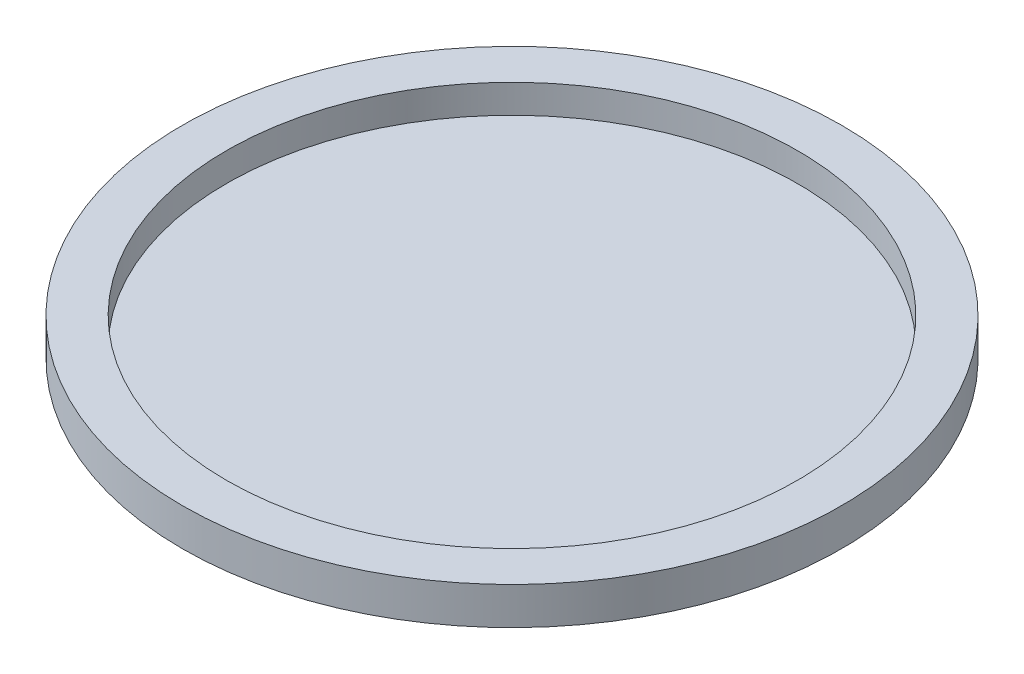
ISO-10303-21;
HEADER;
FILE_DESCRIPTION(('STEP AP214'),'2;1');
FILE_NAME('part.step','',(''),(''),'','','');
FILE_SCHEMA(('AUTOMOTIVE_DESIGN { 1 0 10303 214 1 1 1 1 }'));
ENDSEC;
DATA;
#1=APPLICATION_CONTEXT('core data for automotive mechanical design processes');
#2=APPLICATION_PROTOCOL_DEFINITION('international standard','automotive_design',2000,#1);
#3=PRODUCT_CONTEXT('',#1,'mechanical');
#4=PRODUCT('Part','Part','',(#3));
#5=PRODUCT_RELATED_PRODUCT_CATEGORY('part','',(#4));
#6=PRODUCT_DEFINITION_FORMATION('','',#4);
#7=PRODUCT_DEFINITION_CONTEXT('part definition',#1,'design');
#8=PRODUCT_DEFINITION('design','',#6,#7);
#9=PRODUCT_DEFINITION_SHAPE('','',#8);
#10=(LENGTH_UNIT() NAMED_UNIT(*) SI_UNIT(.MILLI.,.METRE.));
#11=(NAMED_UNIT(*) PLANE_ANGLE_UNIT() SI_UNIT($,.RADIAN.));
#12=(NAMED_UNIT(*) SI_UNIT($,.STERADIAN.) SOLID_ANGLE_UNIT());
#13=UNCERTAINTY_MEASURE_WITH_UNIT(LENGTH_MEASURE(1.E-05),#10,'distance_accuracy_value','');
#14=(GEOMETRIC_REPRESENTATION_CONTEXT(3) GLOBAL_UNCERTAINTY_ASSIGNED_CONTEXT((#13)) GLOBAL_UNIT_ASSIGNED_CONTEXT((#10,
#11,#12)) REPRESENTATION_CONTEXT('',''));
#15=CARTESIAN_POINT('',(0.,0.,0.));
#16=DIRECTION('',(0.,0.,1.));
#17=DIRECTION('',(1.,0.,0.));
#18=AXIS2_PLACEMENT_3D('',#15,#16,#17);
#19=CARTESIAN_POINT('',(0.,-0.2,0.));
#20=DIRECTION('',(0.,-1.,0.));
#21=DIRECTION('',(0.,0.,-1.));
#22=AXIS2_PLACEMENT_3D('',#19,#20,#21);
#23=TOROIDAL_SURFACE('',#22,12.4036061854202,1.);
#24=CARTESIAN_POINT('',(0.,-1.2,0.));
#25=DIRECTION('',(0.,-1.,0.));
#26=DIRECTION('',(0.,0.,-1.));
#27=AXIS2_PLACEMENT_3D('',#24,#25,#26);
#28=CIRCLE('',#27,12.4036061854202);
#29=CARTESIAN_POINT('',(0.,-1.2,-12.4036061854202));
#30=VERTEX_POINT('',#29);
#31=EDGE_CURVE('E38',#30,#30,#28,.T.);
#32=ORIENTED_EDGE('',*,*,#31,.F.);
#33=EDGE_LOOP('',(#32));
#34=FACE_BOUND('',#33,.T.);
#35=CARTESIAN_POINT('',(0.,-0.2,0.));
#36=DIRECTION('',(0.,-1.,0.));
#37=DIRECTION('',(0.,0.,-1.));
#38=AXIS2_PLACEMENT_3D('',#35,#36,#37);
#39=CIRCLE('',#38,13.4036061854202);
#40=CARTESIAN_POINT('',(0.,-0.2,-13.4036061854202));
#41=VERTEX_POINT('',#40);
#42=EDGE_CURVE('E10',#41,#41,#39,.F.);
#43=ORIENTED_EDGE('',*,*,#42,.F.);
#44=EDGE_LOOP('',(#43));
#45=FACE_BOUND('',#44,.T.);
#46=ADVANCED_FACE('F32',(#34,#45),#23,.T.);
#47=CARTESIAN_POINT('',(0.,1.7,0.));
#48=DIRECTION('',(0.,-1.,0.));
#49=DIRECTION('',(0.,0.,-1.));
#50=AXIS2_PLACEMENT_3D('',#47,#48,#49);
#51=CYLINDRICAL_SURFACE('',#50,15.);
#52=CARTESIAN_POINT('',(0.,1.7,0.));
#53=DIRECTION('',(0.,1.,0.));
#54=DIRECTION('',(0.,0.,1.));
#55=AXIS2_PLACEMENT_3D('',#52,#53,#54);
#56=CIRCLE('',#55,15.);
#57=CARTESIAN_POINT('',(0.,1.7,15.));
#58=VERTEX_POINT('',#57);
#59=EDGE_CURVE('E46',#58,#58,#56,.T.);
#60=ORIENTED_EDGE('',*,*,#59,.F.);
#61=EDGE_LOOP('',(#60));
#62=FACE_BOUND('',#61,.T.);
#63=CARTESIAN_POINT('',(0.,0.,0.));
#64=DIRECTION('',(0.,1.,0.));
#65=DIRECTION('',(0.,0.,1.));
#66=AXIS2_PLACEMENT_3D('',#63,#64,#65);
#67=CIRCLE('',#66,15.);
#68=CARTESIAN_POINT('',(0.,0.,15.));
#69=VERTEX_POINT('',#68);
#70=EDGE_CURVE('E49',#69,#69,#67,.T.);
#71=ORIENTED_EDGE('',*,*,#70,.T.);
#72=EDGE_LOOP('',(#71));
#73=FACE_BOUND('',#72,.T.);
#74=ADVANCED_FACE('F80',(#62,#73),#51,.T.);
#75=CARTESIAN_POINT('',(0.,1.7,0.));
#76=DIRECTION('',(0.,1.,0.));
#77=DIRECTION('',(0.,0.,1.));
#78=AXIS2_PLACEMENT_3D('',#75,#76,#77);
#79=PLANE('',#78);
#80=CARTESIAN_POINT('',(0.,1.7,0.));
#81=DIRECTION('',(0.,1.,0.));
#82=DIRECTION('',(0.,0.,1.));
#83=AXIS2_PLACEMENT_3D('',#80,#81,#82);
#84=CIRCLE('',#83,12.9986334966851);
#85=CARTESIAN_POINT('',(0.,1.7,12.9986334966851));
#86=VERTEX_POINT('',#85);
#87=EDGE_CURVE('E61',#86,#86,#84,.T.);
#88=ORIENTED_EDGE('',*,*,#87,.F.);
#89=EDGE_LOOP('',(#88));
#90=FACE_BOUND('',#89,.T.);
#91=ORIENTED_EDGE('',*,*,#59,.T.);
#92=EDGE_LOOP('',(#91));
#93=FACE_BOUND('',#92,.T.);
#94=ADVANCED_FACE('F76',(#90,#93),#79,.T.);
#95=CARTESIAN_POINT('',(0.,0.,0.));
#96=DIRECTION('',(0.,1.,0.));
#97=DIRECTION('',(0.,0.,1.));
#98=AXIS2_PLACEMENT_3D('',#95,#96,#97);
#99=PLANE('',#98);
#100=CARTESIAN_POINT('',(0.,0.,0.));
#101=DIRECTION('',(0.,1.,0.));
#102=DIRECTION('',(0.,0.,1.));
#103=AXIS2_PLACEMENT_3D('',#100,#101,#102);
#104=CIRCLE('',#103,13.4036061854202);
#105=CARTESIAN_POINT('',(0.,0.,13.4036061854202));
#106=VERTEX_POINT('',#105);
#107=EDGE_CURVE('E42',#106,#106,#104,.F.);
#108=ORIENTED_EDGE('',*,*,#107,.F.);
#109=EDGE_LOOP('',(#108));
#110=FACE_BOUND('',#109,.T.);
#111=ORIENTED_EDGE('',*,*,#70,.F.);
#112=EDGE_LOOP('',(#111));
#113=FACE_BOUND('',#112,.T.);
#114=ADVANCED_FACE('F79',(#110,#113),#99,.F.);
#115=CARTESIAN_POINT('',(0.,-1.2,0.));
#116=DIRECTION('',(0.,1.,0.));
#117=DIRECTION('',(0.,0.,1.));
#118=AXIS2_PLACEMENT_3D('',#115,#116,#117);
#119=CYLINDRICAL_SURFACE('',#118,13.4036061854202);
#120=ORIENTED_EDGE('',*,*,#42,.T.);
#121=EDGE_LOOP('',(#120));
#122=FACE_BOUND('',#121,.T.);
#123=ORIENTED_EDGE('',*,*,#107,.T.);
#124=EDGE_LOOP('',(#123));
#125=FACE_BOUND('',#124,.T.);
#126=ADVANCED_FACE('F89',(#122,#125),#119,.T.);
#127=CARTESIAN_POINT('',(0.,-1.2,0.));
#128=DIRECTION('',(0.,-1.,0.));
#129=DIRECTION('',(0.,0.,-1.));
#130=AXIS2_PLACEMENT_3D('',#127,#128,#129);
#131=PLANE('',#130);
#132=CARTESIAN_POINT('',(0.,-1.2,0.));
#133=DIRECTION('',(0.,-1.,0.));
#134=DIRECTION('',(0.,0.,-1.));
#135=AXIS2_PLACEMENT_3D('',#132,#133,#134);
#136=CIRCLE('',#135,7.15327575416338);
#137=CARTESIAN_POINT('',(0.,-1.2,-7.15327575416338));
#138=VERTEX_POINT('',#137);
#139=EDGE_CURVE('E55',#138,#138,#136,.T.);
#140=ORIENTED_EDGE('',*,*,#139,.F.);
#141=EDGE_LOOP('',(#140));
#142=FACE_BOUND('',#141,.T.);
#143=ORIENTED_EDGE('',*,*,#31,.T.);
#144=EDGE_LOOP('',(#143));
#145=FACE_BOUND('',#144,.T.);
#146=ADVANCED_FACE('F95',(#142,#145),#131,.T.);
#147=CARTESIAN_POINT('',(0.,-3.3,0.));
#148=DIRECTION('',(0.,1.,0.));
#149=DIRECTION('',(0.,0.,1.));
#150=AXIS2_PLACEMENT_3D('',#147,#148,#149);
#151=CYLINDRICAL_SURFACE('',#150,7.15327575416338);
#152=CARTESIAN_POINT('',(0.,-3.3,0.));
#153=DIRECTION('',(0.,-1.,0.));
#154=DIRECTION('',(0.,0.,-1.));
#155=AXIS2_PLACEMENT_3D('',#152,#153,#154);
#156=CIRCLE('',#155,7.15327575416338);
#157=CARTESIAN_POINT('',(0.,-3.3,-7.15327575416338));
#158=VERTEX_POINT('',#157);
#159=EDGE_CURVE('E52',#158,#158,#156,.T.);
#160=ORIENTED_EDGE('',*,*,#159,.F.);
#161=EDGE_LOOP('',(#160));
#162=FACE_BOUND('',#161,.T.);
#163=ORIENTED_EDGE('',*,*,#139,.T.);
#164=EDGE_LOOP('',(#163));
#165=FACE_BOUND('',#164,.T.);
#166=ADVANCED_FACE('F138',(#162,#165),#151,.T.);
#167=CARTESIAN_POINT('',(0.,-3.3,0.));
#168=DIRECTION('',(0.,-1.,0.));
#169=DIRECTION('',(0.,0.,-1.));
#170=AXIS2_PLACEMENT_3D('',#167,#168,#169);
#171=PLANE('',#170);
#172=ORIENTED_EDGE('',*,*,#159,.T.);
#173=EDGE_LOOP('',(#172));
#174=FACE_BOUND('',#173,.T.);
#175=ADVANCED_FACE('F72',(#174),#171,.T.);
#176=CARTESIAN_POINT('',(0.,0.4,0.));
#177=DIRECTION('',(0.,1.,0.));
#178=DIRECTION('',(0.,0.,1.));
#179=AXIS2_PLACEMENT_3D('',#176,#177,#178);
#180=CYLINDRICAL_SURFACE('',#179,12.9986334966851);
#181=CARTESIAN_POINT('',(0.,0.4,0.));
#182=DIRECTION('',(0.,1.,0.));
#183=DIRECTION('',(0.,0.,1.));
#184=AXIS2_PLACEMENT_3D('',#181,#182,#183);
#185=CIRCLE('',#184,12.9986334966851);
#186=CARTESIAN_POINT('',(0.,0.4,12.9986334966851));
#187=VERTEX_POINT('',#186);
#188=EDGE_CURVE('E58',#187,#187,#185,.T.);
#189=ORIENTED_EDGE('',*,*,#188,.F.);
#190=EDGE_LOOP('',(#189));
#191=FACE_BOUND('',#190,.T.);
#192=ORIENTED_EDGE('',*,*,#87,.T.);
#193=EDGE_LOOP('',(#192));
#194=FACE_BOUND('',#193,.T.);
#195=ADVANCED_FACE('F69',(#191,#194),#180,.F.);
#196=CARTESIAN_POINT('',(0.,0.4,0.));
#197=DIRECTION('',(0.,1.,0.));
#198=DIRECTION('',(0.,0.,1.));
#199=AXIS2_PLACEMENT_3D('',#196,#197,#198);
#200=PLANE('',#199);
#201=ORIENTED_EDGE('',*,*,#188,.T.);
#202=EDGE_LOOP('',(#201));
#203=FACE_BOUND('',#202,.T.);
#204=ADVANCED_FACE('F67',(#203),#200,.T.);
#205=CLOSED_SHELL('',(#46,#74,#94,#114,#126,#146,#166,#175,#195,#204));
#206=MANIFOLD_SOLID_BREP('B2',#205);
#207=ADVANCED_BREP_SHAPE_REPRESENTATION('',(#18,#206),#14);
#208=SHAPE_DEFINITION_REPRESENTATION(#9,#207);
ENDSEC;
END-ISO-10303-21;
